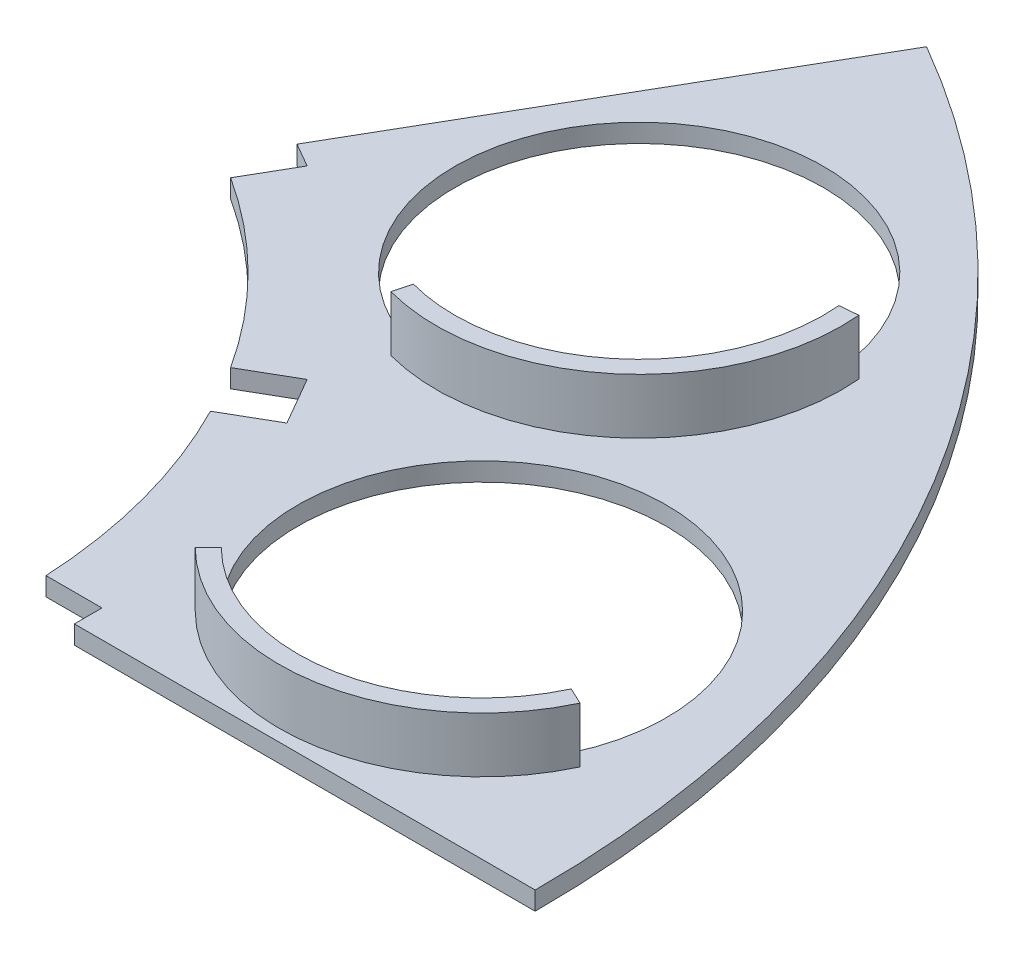
ISO-10303-21;
HEADER;
FILE_DESCRIPTION(('STEP AP214'),'2;1');
FILE_NAME('part.step','',(''),(''),'','','');
FILE_SCHEMA(('AUTOMOTIVE_DESIGN { 1 0 10303 214 1 1 1 1 }'));
ENDSEC;
DATA;
#1=APPLICATION_CONTEXT('core data for automotive mechanical design processes');
#2=APPLICATION_PROTOCOL_DEFINITION('international standard','automotive_design',2000,#1);
#3=PRODUCT_CONTEXT('',#1,'mechanical');
#4=PRODUCT('Part','Part','',(#3));
#5=PRODUCT_RELATED_PRODUCT_CATEGORY('part','',(#4));
#6=PRODUCT_DEFINITION_FORMATION('','',#4);
#7=PRODUCT_DEFINITION_CONTEXT('part definition',#1,'design');
#8=PRODUCT_DEFINITION('design','',#6,#7);
#9=PRODUCT_DEFINITION_SHAPE('','',#8);
#10=(LENGTH_UNIT() NAMED_UNIT(*) SI_UNIT(.MILLI.,.METRE.));
#11=(NAMED_UNIT(*) PLANE_ANGLE_UNIT() SI_UNIT($,.RADIAN.));
#12=(NAMED_UNIT(*) SI_UNIT($,.STERADIAN.) SOLID_ANGLE_UNIT());
#13=UNCERTAINTY_MEASURE_WITH_UNIT(LENGTH_MEASURE(1.E-05),#10,'distance_accuracy_value','');
#14=(GEOMETRIC_REPRESENTATION_CONTEXT(3) GLOBAL_UNCERTAINTY_ASSIGNED_CONTEXT((#13)) GLOBAL_UNIT_ASSIGNED_CONTEXT((#10,
#11,#12)) REPRESENTATION_CONTEXT('',''));
#15=CARTESIAN_POINT('',(0.,0.,0.));
#16=DIRECTION('',(0.,0.,1.));
#17=DIRECTION('',(1.,0.,0.));
#18=AXIS2_PLACEMENT_3D('',#15,#16,#17);
#19=CARTESIAN_POINT('',(0.,5.,0.));
#20=DIRECTION('',(0.,-1.,0.));
#21=DIRECTION('',(0.,0.,-1.));
#22=AXIS2_PLACEMENT_3D('',#19,#20,#21);
#23=CYLINDRICAL_SURFACE('',#22,150.);
#24=CARTESIAN_POINT('',(0.,5.,0.));
#25=DIRECTION('',(0.,-1.,0.));
#26=DIRECTION('',(0.,0.,1.));
#27=AXIS2_PLACEMENT_3D('',#24,#25,#26);
#28=CIRCLE('',#27,150.);
#29=CARTESIAN_POINT('',(81.4013818612761,5.,-125.991329190047));
#30=VERTEX_POINT('',#29);
#31=CARTESIAN_POINT('',(125.991329190046,5.,-81.4013818612767));
#32=VERTEX_POINT('',#31);
#33=EDGE_CURVE('E218',#30,#32,#28,.T.);
#34=ORIENTED_EDGE('',*,*,#33,.F.);
#35=DIRECTION('',(0.,1.,0.));
#36=VECTOR('',#35,1.);
#37=CARTESIAN_POINT('',(81.4013818612761,0.,-125.991329190047));
#38=LINE('',#37,#36);
#39=CARTESIAN_POINT('',(81.4013818612761,0.,-125.991329190047));
#40=VERTEX_POINT('',#39);
#41=EDGE_CURVE('E370',#40,#30,#38,.T.);
#42=ORIENTED_EDGE('',*,*,#41,.F.);
#43=CARTESIAN_POINT('',(0.,0.,0.));
#44=DIRECTION('',(0.,-1.,0.));
#45=DIRECTION('',(0.,0.,1.));
#46=AXIS2_PLACEMENT_3D('',#43,#44,#45);
#47=CIRCLE('',#46,150.);
#48=CARTESIAN_POINT('',(125.991329190046,0.,-81.4013818612767));
#49=VERTEX_POINT('',#48);
#50=EDGE_CURVE('E195',#40,#49,#47,.T.);
#51=ORIENTED_EDGE('',*,*,#50,.T.);
#52=DIRECTION('',(0.,1.,0.));
#53=VECTOR('',#52,1.);
#54=CARTESIAN_POINT('',(125.991329190046,0.,-81.4013818612767));
#55=LINE('',#54,#53);
#56=EDGE_CURVE('E357',#49,#32,#55,.T.);
#57=ORIENTED_EDGE('',*,*,#56,.T.);
#58=EDGE_LOOP('',(#34,#42,#51,#57));
#59=FACE_BOUND('',#58,.T.);
#60=ADVANCED_FACE('F37',(#59),#23,.F.);
#61=CARTESIAN_POINT('',(0.,5.,0.));
#62=DIRECTION('',(0.,1.,0.));
#63=DIRECTION('',(0.,0.,1.));
#64=AXIS2_PLACEMENT_3D('',#61,#62,#63);
#65=PLANE('',#64);
#66=DIRECTION('',(-1.,0.,0.));
#67=VECTOR('',#66,1.);
#68=CARTESIAN_POINT('',(149.812382665786,5.,-7.5));
#69=LINE('',#68,#67);
#70=CARTESIAN_POINT('',(165.,5.,-7.5));
#71=VERTEX_POINT('',#70);
#72=CARTESIAN_POINT('',(149.812382665786,5.,-7.5));
#73=VERTEX_POINT('',#72);
#74=EDGE_CURVE('E182',#71,#73,#69,.T.);
#75=ORIENTED_EDGE('',*,*,#74,.F.);
#76=DIRECTION('',(0.,0.,-1.));
#77=VECTOR('',#76,1.);
#78=CARTESIAN_POINT('',(165.,5.,0.));
#79=LINE('',#78,#77);
#80=CARTESIAN_POINT('',(165.,5.,0.));
#81=VERTEX_POINT('',#80);
#82=EDGE_CURVE('E374',#81,#71,#79,.T.);
#83=ORIENTED_EDGE('',*,*,#82,.F.);
#84=DIRECTION('',(1.,0.,0.));
#85=VECTOR('',#84,1.);
#86=CARTESIAN_POINT('',(150.,5.,0.));
#87=LINE('',#86,#85);
#88=CARTESIAN_POINT('',(290.,5.,0.));
#89=VERTEX_POINT('',#88);
#90=EDGE_CURVE('E189',#81,#89,#87,.T.);
#91=ORIENTED_EDGE('',*,*,#90,.T.);
#92=CARTESIAN_POINT('',(0.,5.,0.));
#93=DIRECTION('',(0.,1.,0.));
#94=DIRECTION('',(0.,0.,1.));
#95=AXIS2_PLACEMENT_3D('',#92,#93,#94);
#96=CIRCLE('',#95,290.);
#97=CARTESIAN_POINT('',(144.999999999999,5.,-251.147367097488));
#98=VERTEX_POINT('',#97);
#99=EDGE_CURVE('E212',#89,#98,#96,.T.);
#100=ORIENTED_EDGE('',*,*,#99,.T.);
#101=DIRECTION('',(-0.499999999999998,0.,0.86602540378444));
#102=VECTOR('',#101,1.);
#103=CARTESIAN_POINT('',(74.9999999999997,5.,-129.903810567666));
#104=LINE('',#103,#102);
#105=CARTESIAN_POINT('',(82.4999999999996,5.,-142.894191624433));
#106=VERTEX_POINT('',#105);
#107=EDGE_CURVE('E207',#98,#106,#104,.T.);
#108=ORIENTED_EDGE('',*,*,#107,.T.);
#109=DIRECTION('',(-0.866025403784439,0.,-0.5));
#110=VECTOR('',#109,1.);
#111=CARTESIAN_POINT('',(82.4999999999996,5.,-142.894191624433));
#112=LINE('',#111,#110);
#113=CARTESIAN_POINT('',(88.9951905283829,5.,-139.144191624433));
#114=VERTEX_POINT('',#113);
#115=EDGE_CURVE('E368',#114,#106,#112,.T.);
#116=ORIENTED_EDGE('',*,*,#115,.F.);
#117=DIRECTION('',(0.499999999999997,0.,-0.86602540378444));
#118=VECTOR('',#117,1.);
#119=CARTESIAN_POINT('',(88.9951905283829,5.,-139.144191624433));
#120=LINE('',#119,#118);
#121=EDGE_CURVE('E371',#30,#114,#120,.T.);
#122=ORIENTED_EDGE('',*,*,#121,.F.);
#123=ORIENTED_EDGE('',*,*,#33,.T.);
#124=DIRECTION('',(-0.866025403784438,0.,0.500000000000002));
#125=VECTOR('',#124,1.);
#126=CARTESIAN_POINT('',(125.991329190046,5.,-81.4013818612767));
#127=LINE('',#126,#125);
#128=CARTESIAN_POINT('',(139.144191624432,5.,-88.9951905283836));
#129=VERTEX_POINT('',#128);
#130=EDGE_CURVE('E341',#129,#32,#127,.T.);
#131=ORIENTED_EDGE('',*,*,#130,.F.);
#132=DIRECTION('',(-0.500000000000001,0.,-0.866025403784438));
#133=VECTOR('',#132,1.);
#134=CARTESIAN_POINT('',(139.144191624432,5.,-88.9951905283836));
#135=LINE('',#134,#133);
#136=CARTESIAN_POINT('',(146.644191624432,5.,-76.004809471617));
#137=VERTEX_POINT('',#136);
#138=EDGE_CURVE('E353',#137,#129,#135,.T.);
#139=ORIENTED_EDGE('',*,*,#138,.F.);
#140=DIRECTION('',(0.866025403784439,0.,-0.5));
#141=VECTOR('',#140,1.);
#142=CARTESIAN_POINT('',(146.644191624432,5.,-76.004809471617));
#143=LINE('',#142,#141);
#144=CARTESIAN_POINT('',(133.491329190046,5.,-68.4110008045102));
#145=VERTEX_POINT('',#144);
#146=EDGE_CURVE('E349',#145,#137,#143,.T.);
#147=ORIENTED_EDGE('',*,*,#146,.F.);
#148=EDGE_CURVE('E205',#145,#73,#28,.T.);
#149=ORIENTED_EDGE('',*,*,#148,.T.);
#150=EDGE_LOOP('',(#75,#83,#91,#100,#108,#116,#122,#123,#131,#139,#147,#149));
#151=FACE_BOUND('',#150,.T.);
#152=DIRECTION('',(-0.996194698091746,0.,0.0871557427476577));
#153=VECTOR('',#152,1.);
#154=CARTESIAN_POINT('',(213.889734162019,5.,-163.892591618095));
#155=LINE('',#154,#153);
#156=CARTESIAN_POINT('',(213.889734162019,5.,-163.892591618095));
#157=VERTEX_POINT('',#156);
#158=CARTESIAN_POINT('',(208.90876067156,5.,-163.456812904356));
#159=VERTEX_POINT('',#158);
#160=EDGE_CURVE('E246',#157,#159,#155,.T.);
#161=ORIENTED_EDGE('',*,*,#160,.F.);
#162=CARTESIAN_POINT('',(159.099025766973,5.,-159.099025766974));
#163=DIRECTION('',(0.,1.,0.));
#164=DIRECTION('',(0.,0.,1.));
#165=AXIS2_PLACEMENT_3D('',#162,#163,#164);
#166=CIRCLE('',#165,55.);
#167=CARTESIAN_POINT('',(144.863978286334,5.,-105.973105321075));
#168=VERTEX_POINT('',#167);
#169=EDGE_CURVE('E250',#168,#157,#166,.T.);
#170=ORIENTED_EDGE('',*,*,#169,.F.);
#171=DIRECTION('',(-0.25881904510252,0.,0.965925826289069));
#172=VECTOR('',#171,1.);
#173=CARTESIAN_POINT('',(146.158073511847,5.,-110.80273445252));
#174=LINE('',#173,#172);
#175=CARTESIAN_POINT('',(146.158073511847,5.,-110.80273445252));
#176=VERTEX_POINT('',#175);
#177=EDGE_CURVE('E253',#176,#168,#174,.T.);
#178=ORIENTED_EDGE('',*,*,#177,.F.);
#179=CARTESIAN_POINT('',(159.099025766973,5.,-159.099025766974));
#180=DIRECTION('',(0.,1.,0.));
#181=DIRECTION('',(0.,0.,1.));
#182=AXIS2_PLACEMENT_3D('',#179,#180,#181);
#183=CIRCLE('',#182,50.);
#184=EDGE_CURVE('E224',#159,#176,#183,.T.);
#185=ORIENTED_EDGE('',*,*,#184,.F.);
#186=EDGE_LOOP('',(#161,#170,#178,#185));
#187=FACE_BOUND('',#186,.T.);
#188=CARTESIAN_POINT('',(217.33331091504,5.,-58.2342851480674));
#189=DIRECTION('',(0.,1.,0.));
#190=DIRECTION('',(0.,0.,1.));
#191=AXIS2_PLACEMENT_3D('',#188,#189,#190);
#192=CIRCLE('',#191,55.);
#193=CARTESIAN_POINT('',(178.44243794978,5.,-19.3434121828074));
#194=VERTEX_POINT('',#193);
#195=CARTESIAN_POINT('',(267.180239202056,5.,-34.9902807523289));
#196=VERTEX_POINT('',#195);
#197=EDGE_CURVE('E276',#194,#196,#192,.T.);
#198=ORIENTED_EDGE('',*,*,#197,.F.);
#199=DIRECTION('',(-0.707106781186549,0.,0.707106781186546));
#200=VECTOR('',#199,1.);
#201=CARTESIAN_POINT('',(181.977971855713,5.,-22.8789460887401));
#202=LINE('',#201,#200);
#203=CARTESIAN_POINT('',(181.977971855713,5.,-22.8789460887401));
#204=VERTEX_POINT('',#203);
#205=EDGE_CURVE('E256',#204,#194,#202,.T.);
#206=ORIENTED_EDGE('',*,*,#205,.F.);
#207=CARTESIAN_POINT('',(217.33331091504,5.,-58.2342851480674));
#208=DIRECTION('',(0.,1.,0.));
#209=DIRECTION('',(0.,0.,1.));
#210=AXIS2_PLACEMENT_3D('',#207,#208,#209);
#211=CIRCLE('',#210,50.);
#212=CARTESIAN_POINT('',(262.648700266873,5.,-37.1033720610323));
#213=VERTEX_POINT('',#212);
#214=EDGE_CURVE('E228',#213,#204,#211,.T.);
#215=ORIENTED_EDGE('',*,*,#214,.F.);
#216=DIRECTION('',(-0.906307787036652,0.,-0.422618261740696));
#217=VECTOR('',#216,1.);
#218=CARTESIAN_POINT('',(262.648700266873,5.,-37.1033720610323));
#219=LINE('',#218,#217);
#220=EDGE_CURVE('E267',#196,#213,#219,.T.);
#221=ORIENTED_EDGE('',*,*,#220,.F.);
#222=EDGE_LOOP('',(#198,#206,#215,#221));
#223=FACE_BOUND('',#222,.T.);
#224=ADVANCED_FACE('F397',(#151,#187,#223),#65,.T.);
#225=CARTESIAN_POINT('',(133.491329190046,0.,-68.4110008045102));
#226=VERTEX_POINT('',#225);
#227=CARTESIAN_POINT('',(149.812382665786,0.,-7.5));
#228=VERTEX_POINT('',#227);
#229=EDGE_CURVE('E200',#226,#228,#47,.T.);
#230=ORIENTED_EDGE('',*,*,#229,.T.);
#231=DIRECTION('',(0.,1.,0.));
#232=VECTOR('',#231,1.);
#233=CARTESIAN_POINT('',(149.812382665786,0.,-7.5));
#234=LINE('',#233,#232);
#235=EDGE_CURVE('E320',#228,#73,#234,.T.);
#236=ORIENTED_EDGE('',*,*,#235,.T.);
#237=ORIENTED_EDGE('',*,*,#148,.F.);
#238=DIRECTION('',(0.,1.,0.));
#239=VECTOR('',#238,1.);
#240=CARTESIAN_POINT('',(133.491329190046,0.,-68.4110008045102));
#241=LINE('',#240,#239);
#242=EDGE_CURVE('E348',#226,#145,#241,.T.);
#243=ORIENTED_EDGE('',*,*,#242,.F.);
#244=EDGE_LOOP('',(#230,#236,#237,#243));
#245=FACE_BOUND('',#244,.T.);
#246=ADVANCED_FACE('F39',(#245),#23,.F.);
#247=CARTESIAN_POINT('',(150.,5.,0.));
#248=DIRECTION('',(0.,0.,-1.));
#249=DIRECTION('',(-1.,0.,0.));
#250=AXIS2_PLACEMENT_3D('',#247,#248,#249);
#251=PLANE('',#250);
#252=ORIENTED_EDGE('',*,*,#90,.F.);
#253=DIRECTION('',(0.,1.,0.));
#254=VECTOR('',#253,1.);
#255=CARTESIAN_POINT('',(165.,0.,0.));
#256=LINE('',#255,#254);
#257=CARTESIAN_POINT('',(165.,0.,0.));
#258=VERTEX_POINT('',#257);
#259=EDGE_CURVE('E177',#258,#81,#256,.T.);
#260=ORIENTED_EDGE('',*,*,#259,.F.);
#261=DIRECTION('',(1.,0.,0.));
#262=VECTOR('',#261,1.);
#263=CARTESIAN_POINT('',(150.,0.,0.));
#264=LINE('',#263,#262);
#265=CARTESIAN_POINT('',(290.,0.,0.));
#266=VERTEX_POINT('',#265);
#267=EDGE_CURVE('E188',#258,#266,#264,.T.);
#268=ORIENTED_EDGE('',*,*,#267,.T.);
#269=DIRECTION('',(0.,-1.,0.));
#270=VECTOR('',#269,1.);
#271=CARTESIAN_POINT('',(290.,5.,0.));
#272=LINE('',#271,#270);
#273=EDGE_CURVE('E11',#89,#266,#272,.T.);
#274=ORIENTED_EDGE('',*,*,#273,.F.);
#275=EDGE_LOOP('',(#252,#260,#268,#274));
#276=FACE_BOUND('',#275,.T.);
#277=ADVANCED_FACE('F186',(#276),#251,.F.);
#278=CARTESIAN_POINT('',(0.,5.,0.));
#279=DIRECTION('',(0.,-1.,0.));
#280=DIRECTION('',(0.,0.,-1.));
#281=AXIS2_PLACEMENT_3D('',#278,#279,#280);
#282=CYLINDRICAL_SURFACE('',#281,290.);
#283=CARTESIAN_POINT('',(0.,0.,0.));
#284=DIRECTION('',(0.,1.,0.));
#285=DIRECTION('',(0.,0.,1.));
#286=AXIS2_PLACEMENT_3D('',#283,#284,#285);
#287=CIRCLE('',#286,290.);
#288=CARTESIAN_POINT('',(144.999999999999,0.,-251.147367097488));
#289=VERTEX_POINT('',#288);
#290=EDGE_CURVE('E194',#266,#289,#287,.T.);
#291=ORIENTED_EDGE('',*,*,#290,.T.);
#292=DIRECTION('',(0.,-1.,0.));
#293=VECTOR('',#292,1.);
#294=CARTESIAN_POINT('',(144.999999999999,5.,-251.147367097488));
#295=LINE('',#294,#293);
#296=EDGE_CURVE('E45',#98,#289,#295,.T.);
#297=ORIENTED_EDGE('',*,*,#296,.F.);
#298=ORIENTED_EDGE('',*,*,#99,.F.);
#299=ORIENTED_EDGE('',*,*,#273,.T.);
#300=EDGE_LOOP('',(#291,#297,#298,#299));
#301=FACE_BOUND('',#300,.T.);
#302=ADVANCED_FACE('F415',(#301),#282,.T.);
#303=CARTESIAN_POINT('',(74.9999999999997,5.,-129.903810567666));
#304=DIRECTION('',(0.86602540378444,0.,0.499999999999998));
#305=DIRECTION('',(0.499999999999998,0.,-0.86602540378444));
#306=AXIS2_PLACEMENT_3D('',#303,#304,#305);
#307=PLANE('',#306);
#308=DIRECTION('',(-0.499999999999998,0.,0.86602540378444));
#309=VECTOR('',#308,1.);
#310=CARTESIAN_POINT('',(74.9999999999997,0.,-129.903810567666));
#311=LINE('',#310,#309);
#312=CARTESIAN_POINT('',(82.4999999999996,0.,-142.894191624433));
#313=VERTEX_POINT('',#312);
#314=EDGE_CURVE('E197',#289,#313,#311,.T.);
#315=ORIENTED_EDGE('',*,*,#314,.T.);
#316=DIRECTION('',(0.,1.,0.));
#317=VECTOR('',#316,1.);
#318=CARTESIAN_POINT('',(82.4999999999996,0.,-142.894191624433));
#319=LINE('',#318,#317);
#320=EDGE_CURVE('E352',#313,#106,#319,.T.);
#321=ORIENTED_EDGE('',*,*,#320,.T.);
#322=ORIENTED_EDGE('',*,*,#107,.F.);
#323=ORIENTED_EDGE('',*,*,#296,.T.);
#324=EDGE_LOOP('',(#315,#321,#322,#323));
#325=FACE_BOUND('',#324,.T.);
#326=ADVANCED_FACE('F413',(#325),#307,.F.);
#327=CARTESIAN_POINT('',(0.,0.,0.));
#328=DIRECTION('',(0.,1.,0.));
#329=DIRECTION('',(0.,0.,1.));
#330=AXIS2_PLACEMENT_3D('',#327,#328,#329);
#331=PLANE('',#330);
#332=CARTESIAN_POINT('',(277.604561184667,0.,-36.5473338216145));
#333=DIRECTION('',(0.,-1.,0.));
#334=DIRECTION('',(0.,0.,-1.));
#335=AXIS2_PLACEMENT_3D('',#332,#333,#334);
#336=CIRCLE('',#335,3.60000000000001);
#337=CARTESIAN_POINT('',(277.604561184667,0.,-40.1473338216145));
#338=VERTEX_POINT('',#337);
#339=EDGE_CURVE('E315',#338,#338,#336,.T.);
#340=ORIENTED_EDGE('',*,*,#339,.F.);
#341=EDGE_LOOP('',(#340));
#342=FACE_BOUND('',#341,.T.);
#343=CARTESIAN_POINT('',(168.545626433548,0.,-22.1894526774088));
#344=DIRECTION('',(0.,-1.,0.));
#345=DIRECTION('',(0.,0.,-1.));
#346=AXIS2_PLACEMENT_3D('',#343,#344,#345);
#347=CIRCLE('',#346,3.59999999999999);
#348=CARTESIAN_POINT('',(168.545626433548,0.,-25.7894526774088));
#349=VERTEX_POINT('',#348);
#350=EDGE_CURVE('E319',#349,#349,#347,.T.);
#351=ORIENTED_EDGE('',*,*,#350,.F.);
#352=EDGE_LOOP('',(#351));
#353=FACE_BOUND('',#352,.T.);
#354=CARTESIAN_POINT('',(157.059520526919,0.,-65.0561835020654));
#355=DIRECTION('',(0.,-1.,0.));
#356=DIRECTION('',(0.,0.,-1.));
#357=AXIS2_PLACEMENT_3D('',#354,#355,#356);
#358=CIRCLE('',#357,3.59999999999998);
#359=CARTESIAN_POINT('',(157.059520526919,0.,-68.6561835020654));
#360=VERTEX_POINT('',#359);
#361=EDGE_CURVE('E326',#360,#360,#358,.T.);
#362=ORIENTED_EDGE('',*,*,#361,.F.);
#363=EDGE_LOOP('',(#362));
#364=FACE_BOUND('',#363,.T.);
#365=CARTESIAN_POINT('',(134.87006784951,0.,-103.489442931483));
#366=DIRECTION('',(0.,-1.,0.));
#367=DIRECTION('',(0.,0.,-1.));
#368=AXIS2_PLACEMENT_3D('',#365,#366,#367);
#369=CIRCLE('',#368,3.59999999999998);
#370=CARTESIAN_POINT('',(134.87006784951,0.,-107.089442931483));
#371=VERTEX_POINT('',#370);
#372=EDGE_CURVE('E294',#371,#371,#369,.T.);
#373=ORIENTED_EDGE('',*,*,#372,.F.);
#374=EDGE_LOOP('',(#373));
#375=FACE_BOUND('',#374,.T.);
#376=CARTESIAN_POINT('',(103.489442931482,0.,-134.87006784951));
#377=DIRECTION('',(0.,-1.,0.));
#378=DIRECTION('',(0.,0.,-1.));
#379=AXIS2_PLACEMENT_3D('',#376,#377,#378);
#380=CIRCLE('',#379,3.6);
#381=CARTESIAN_POINT('',(103.489442931482,0.,-138.47006784951));
#382=VERTEX_POINT('',#381);
#383=EDGE_CURVE('E293',#382,#382,#380,.T.);
#384=ORIENTED_EDGE('',*,*,#383,.F.);
#385=EDGE_LOOP('',(#384));
#386=FACE_BOUND('',#385,.T.);
#387=CARTESIAN_POINT('',(170.453200122441,0.,-222.138935281546));
#388=DIRECTION('',(0.,-1.,0.));
#389=DIRECTION('',(0.,0.,-1.));
#390=AXIS2_PLACEMENT_3D('',#387,#388,#389);
#391=CIRCLE('',#390,3.59999999999998);
#392=CARTESIAN_POINT('',(170.453200122441,0.,-225.738935281546));
#393=VERTEX_POINT('',#392);
#394=EDGE_CURVE('E300',#393,#393,#391,.T.);
#395=ORIENTED_EDGE('',*,*,#394,.F.);
#396=EDGE_LOOP('',(#395));
#397=FACE_BOUND('',#396,.T.);
#398=CARTESIAN_POINT('',(222.138935281546,0.,-170.453200122442));
#399=DIRECTION('',(0.,-1.,0.));
#400=DIRECTION('',(0.,0.,-1.));
#401=AXIS2_PLACEMENT_3D('',#398,#399,#400);
#402=CIRCLE('',#401,3.59999999999998);
#403=CARTESIAN_POINT('',(222.138935281546,0.,-174.053200122442));
#404=VERTEX_POINT('',#403);
#405=EDGE_CURVE('E306',#404,#404,#402,.T.);
#406=ORIENTED_EDGE('',*,*,#405,.F.);
#407=EDGE_LOOP('',(#406));
#408=FACE_BOUND('',#407,.T.);
#409=CARTESIAN_POINT('',(258.68626910316,0.,-107.151361062225));
#410=DIRECTION('',(0.,-1.,0.));
#411=DIRECTION('',(0.,0.,-1.));
#412=AXIS2_PLACEMENT_3D('',#409,#410,#411);
#413=CIRCLE('',#412,3.60000000000001);
#414=CARTESIAN_POINT('',(258.68626910316,0.,-110.751361062225));
#415=VERTEX_POINT('',#414);
#416=EDGE_CURVE('E312',#415,#415,#413,.T.);
#417=ORIENTED_EDGE('',*,*,#416,.F.);
#418=EDGE_LOOP('',(#417));
#419=FACE_BOUND('',#418,.T.);
#420=CARTESIAN_POINT('',(217.33331091504,0.,-58.2342851480674));
#421=DIRECTION('',(0.,1.,0.));
#422=DIRECTION('',(0.,0.,1.));
#423=AXIS2_PLACEMENT_3D('',#420,#421,#422);
#424=CIRCLE('',#423,50.);
#425=CARTESIAN_POINT('',(217.33331091504,0.,-8.23428514806733));
#426=VERTEX_POINT('',#425);
#427=EDGE_CURVE('E231',#426,#426,#424,.T.);
#428=ORIENTED_EDGE('',*,*,#427,.T.);
#429=EDGE_LOOP('',(#428));
#430=FACE_BOUND('',#429,.T.);
#431=CARTESIAN_POINT('',(159.099025766973,0.,-159.099025766974));
#432=DIRECTION('',(0.,1.,0.));
#433=DIRECTION('',(0.,0.,1.));
#434=AXIS2_PLACEMENT_3D('',#431,#432,#433);
#435=CIRCLE('',#434,50.);
#436=CARTESIAN_POINT('',(159.099025766973,0.,-109.099025766974));
#437=VERTEX_POINT('',#436);
#438=EDGE_CURVE('E221',#437,#437,#435,.T.);
#439=ORIENTED_EDGE('',*,*,#438,.T.);
#440=EDGE_LOOP('',(#439));
#441=FACE_BOUND('',#440,.T.);
#442=DIRECTION('',(0.,0.,-1.));
#443=VECTOR('',#442,1.);
#444=CARTESIAN_POINT('',(165.,0.,0.));
#445=LINE('',#444,#443);
#446=CARTESIAN_POINT('',(165.,0.,-7.5));
#447=VERTEX_POINT('',#446);
#448=EDGE_CURVE('E173',#258,#447,#445,.T.);
#449=ORIENTED_EDGE('',*,*,#448,.T.);
#450=DIRECTION('',(-1.,0.,0.));
#451=VECTOR('',#450,1.);
#452=CARTESIAN_POINT('',(149.812382665786,0.,-7.5));
#453=LINE('',#452,#451);
#454=EDGE_CURVE('E52',#447,#228,#453,.T.);
#455=ORIENTED_EDGE('',*,*,#454,.T.);
#456=ORIENTED_EDGE('',*,*,#229,.F.);
#457=DIRECTION('',(0.866025403784439,0.,-0.5));
#458=VECTOR('',#457,1.);
#459=CARTESIAN_POINT('',(146.644191624432,0.,-76.004809471617));
#460=LINE('',#459,#458);
#461=CARTESIAN_POINT('',(146.644191624432,0.,-76.004809471617));
#462=VERTEX_POINT('',#461);
#463=EDGE_CURVE('E338',#226,#462,#460,.T.);
#464=ORIENTED_EDGE('',*,*,#463,.T.);
#465=DIRECTION('',(-0.500000000000001,0.,-0.866025403784438));
#466=VECTOR('',#465,1.);
#467=CARTESIAN_POINT('',(139.144191624432,0.,-88.9951905283836));
#468=LINE('',#467,#466);
#469=CARTESIAN_POINT('',(139.144191624432,0.,-88.9951905283836));
#470=VERTEX_POINT('',#469);
#471=EDGE_CURVE('E342',#462,#470,#468,.T.);
#472=ORIENTED_EDGE('',*,*,#471,.T.);
#473=DIRECTION('',(-0.866025403784438,0.,0.500000000000002));
#474=VECTOR('',#473,1.);
#475=CARTESIAN_POINT('',(125.991329190046,0.,-81.4013818612767));
#476=LINE('',#475,#474);
#477=EDGE_CURVE('E345',#470,#49,#476,.T.);
#478=ORIENTED_EDGE('',*,*,#477,.T.);
#479=ORIENTED_EDGE('',*,*,#50,.F.);
#480=DIRECTION('',(0.499999999999997,0.,-0.86602540378444));
#481=VECTOR('',#480,1.);
#482=CARTESIAN_POINT('',(88.9951905283829,0.,-139.144191624433));
#483=LINE('',#482,#481);
#484=CARTESIAN_POINT('',(88.9951905283829,0.,-139.144191624433));
#485=VERTEX_POINT('',#484);
#486=EDGE_CURVE('E365',#40,#485,#483,.T.);
#487=ORIENTED_EDGE('',*,*,#486,.T.);
#488=DIRECTION('',(-0.866025403784439,0.,-0.5));
#489=VECTOR('',#488,1.);
#490=CARTESIAN_POINT('',(82.4999999999996,0.,-142.894191624433));
#491=LINE('',#490,#489);
#492=EDGE_CURVE('E60',#485,#313,#491,.T.);
#493=ORIENTED_EDGE('',*,*,#492,.T.);
#494=ORIENTED_EDGE('',*,*,#314,.F.);
#495=ORIENTED_EDGE('',*,*,#290,.F.);
#496=ORIENTED_EDGE('',*,*,#267,.F.);
#497=EDGE_LOOP('',(#449,#455,#456,#464,#472,#478,#479,#487,#493,#494,#495,#496));
#498=FACE_BOUND('',#497,.T.);
#499=ADVANCED_FACE('F192',(#342,#353,#364,#375,#386,#397,#408,#419,#430,#441,#498),#331,.F.);
#500=CARTESIAN_POINT('',(159.099025766973,0.,-159.099025766974));
#501=DIRECTION('',(0.,1.,0.));
#502=DIRECTION('',(0.,0.,1.));
#503=AXIS2_PLACEMENT_3D('',#500,#501,#502);
#504=CYLINDRICAL_SURFACE('',#503,50.);
#505=ORIENTED_EDGE('',*,*,#438,.F.);
#506=EDGE_LOOP('',(#505));
#507=FACE_BOUND('',#506,.T.);
#508=ORIENTED_EDGE('',*,*,#184,.T.);
#509=DIRECTION('',(0.,-1.,0.));
#510=VECTOR('',#509,1.);
#511=CARTESIAN_POINT('',(146.158073511847,20.,-110.80273445252));
#512=LINE('',#511,#510);
#513=CARTESIAN_POINT('',(146.158073511847,20.,-110.80273445252));
#514=VERTEX_POINT('',#513);
#515=EDGE_CURVE('E225',#514,#176,#512,.T.);
#516=ORIENTED_EDGE('',*,*,#515,.F.);
#517=CARTESIAN_POINT('',(159.099025766973,20.,-159.099025766974));
#518=DIRECTION('',(0.,-1.,0.));
#519=DIRECTION('',(0.,0.,1.));
#520=AXIS2_PLACEMENT_3D('',#517,#518,#519);
#521=CIRCLE('',#520,50.);
#522=CARTESIAN_POINT('',(208.90876067156,20.,-163.456812904356));
#523=VERTEX_POINT('',#522);
#524=EDGE_CURVE('E249',#523,#514,#521,.T.);
#525=ORIENTED_EDGE('',*,*,#524,.F.);
#526=DIRECTION('',(0.,-1.,0.));
#527=VECTOR('',#526,1.);
#528=CARTESIAN_POINT('',(208.90876067156,20.,-163.456812904356));
#529=LINE('',#528,#527);
#530=EDGE_CURVE('E242',#523,#159,#529,.T.);
#531=ORIENTED_EDGE('',*,*,#530,.T.);
#532=EDGE_LOOP('',(#508,#516,#525,#531));
#533=FACE_BOUND('',#532,.T.);
#534=ADVANCED_FACE('F421',(#507,#533),#504,.F.);
#535=CARTESIAN_POINT('',(217.33331091504,0.,-58.2342851480674));
#536=DIRECTION('',(0.,1.,0.));
#537=DIRECTION('',(0.,0.,1.));
#538=AXIS2_PLACEMENT_3D('',#535,#536,#537);
#539=CYLINDRICAL_SURFACE('',#538,50.);
#540=ORIENTED_EDGE('',*,*,#427,.F.);
#541=EDGE_LOOP('',(#540));
#542=FACE_BOUND('',#541,.T.);
#543=ORIENTED_EDGE('',*,*,#214,.T.);
#544=DIRECTION('',(0.,-1.,0.));
#545=VECTOR('',#544,1.);
#546=CARTESIAN_POINT('',(181.977971855713,20.,-22.8789460887401));
#547=LINE('',#546,#545);
#548=CARTESIAN_POINT('',(181.977971855713,20.,-22.8789460887401));
#549=VERTEX_POINT('',#548);
#550=EDGE_CURVE('E287',#549,#204,#547,.T.);
#551=ORIENTED_EDGE('',*,*,#550,.F.);
#552=CARTESIAN_POINT('',(217.33331091504,20.,-58.2342851480674));
#553=DIRECTION('',(0.,-1.,0.));
#554=DIRECTION('',(0.,0.,1.));
#555=AXIS2_PLACEMENT_3D('',#552,#553,#554);
#556=CIRCLE('',#555,50.);
#557=CARTESIAN_POINT('',(262.648700266873,20.,-37.1033720610323));
#558=VERTEX_POINT('',#557);
#559=EDGE_CURVE('E264',#558,#549,#556,.T.);
#560=ORIENTED_EDGE('',*,*,#559,.F.);
#561=DIRECTION('',(0.,-1.,0.));
#562=VECTOR('',#561,1.);
#563=CARTESIAN_POINT('',(262.648700266873,20.,-37.1033720610323));
#564=LINE('',#563,#562);
#565=EDGE_CURVE('E274',#558,#213,#564,.T.);
#566=ORIENTED_EDGE('',*,*,#565,.T.);
#567=EDGE_LOOP('',(#543,#551,#560,#566));
#568=FACE_BOUND('',#567,.T.);
#569=ADVANCED_FACE('F452',(#542,#568),#539,.F.);
#570=CARTESIAN_POINT('',(146.158073511847,20.,-110.80273445252));
#571=DIRECTION('',(0.965925826289068,0.,0.25881904510252));
#572=DIRECTION('',(0.25881904510252,0.,-0.965925826289069));
#573=AXIS2_PLACEMENT_3D('',#570,#571,#572);
#574=PLANE('',#573);
#575=ORIENTED_EDGE('',*,*,#177,.T.);
#576=DIRECTION('',(0.,-1.,0.));
#577=VECTOR('',#576,1.);
#578=CARTESIAN_POINT('',(144.863978286334,20.,-105.973105321075));
#579=LINE('',#578,#577);
#580=CARTESIAN_POINT('',(144.863978286334,20.,-105.973105321075));
#581=VERTEX_POINT('',#580);
#582=EDGE_CURVE('E236',#581,#168,#579,.T.);
#583=ORIENTED_EDGE('',*,*,#582,.F.);
#584=DIRECTION('',(-0.25881904510252,0.,0.965925826289069));
#585=VECTOR('',#584,1.);
#586=CARTESIAN_POINT('',(146.158073511847,20.,-110.80273445252));
#587=LINE('',#586,#585);
#588=EDGE_CURVE('E260',#514,#581,#587,.T.);
#589=ORIENTED_EDGE('',*,*,#588,.F.);
#590=ORIENTED_EDGE('',*,*,#515,.T.);
#591=EDGE_LOOP('',(#575,#583,#589,#590));
#592=FACE_BOUND('',#591,.T.);
#593=ADVANCED_FACE('F464',(#592),#574,.F.);
#594=CARTESIAN_POINT('',(159.099025766973,20.,-159.099025766974));
#595=DIRECTION('',(0.,-1.,0.));
#596=DIRECTION('',(0.,0.,-1.));
#597=AXIS2_PLACEMENT_3D('',#594,#595,#596);
#598=CYLINDRICAL_SURFACE('',#597,55.);
#599=ORIENTED_EDGE('',*,*,#169,.T.);
#600=DIRECTION('',(0.,-1.,0.));
#601=VECTOR('',#600,1.);
#602=CARTESIAN_POINT('',(213.889734162019,20.,-163.892591618095));
#603=LINE('',#602,#601);
#604=CARTESIAN_POINT('',(213.889734162019,20.,-163.892591618095));
#605=VERTEX_POINT('',#604);
#606=EDGE_CURVE('E239',#605,#157,#603,.T.);
#607=ORIENTED_EDGE('',*,*,#606,.F.);
#608=CARTESIAN_POINT('',(159.099025766973,20.,-159.099025766974));
#609=DIRECTION('',(0.,1.,0.));
#610=DIRECTION('',(0.,0.,1.));
#611=AXIS2_PLACEMENT_3D('',#608,#609,#610);
#612=CIRCLE('',#611,55.);
#613=EDGE_CURVE('E258',#581,#605,#612,.T.);
#614=ORIENTED_EDGE('',*,*,#613,.F.);
#615=ORIENTED_EDGE('',*,*,#582,.T.);
#616=EDGE_LOOP('',(#599,#607,#614,#615));
#617=FACE_BOUND('',#616,.T.);
#618=ADVANCED_FACE('F475',(#617),#598,.T.);
#619=CARTESIAN_POINT('',(213.889734162019,20.,-163.892591618095));
#620=DIRECTION('',(0.0871557427476577,0.,0.996194698091746));
#621=DIRECTION('',(0.996194698091746,0.,-0.0871557427476577));
#622=AXIS2_PLACEMENT_3D('',#619,#620,#621);
#623=PLANE('',#622);
#624=ORIENTED_EDGE('',*,*,#160,.T.);
#625=ORIENTED_EDGE('',*,*,#530,.F.);
#626=DIRECTION('',(-0.996194698091746,0.,0.0871557427476577));
#627=VECTOR('',#626,1.);
#628=CARTESIAN_POINT('',(213.889734162019,20.,-163.892591618095));
#629=LINE('',#628,#627);
#630=EDGE_CURVE('E245',#605,#523,#629,.T.);
#631=ORIENTED_EDGE('',*,*,#630,.F.);
#632=ORIENTED_EDGE('',*,*,#606,.T.);
#633=EDGE_LOOP('',(#624,#625,#631,#632));
#634=FACE_BOUND('',#633,.T.);
#635=ADVANCED_FACE('F486',(#634),#623,.F.);
#636=CARTESIAN_POINT('',(159.099025766973,20.,-159.099025766974));
#637=DIRECTION('',(0.,1.,0.));
#638=DIRECTION('',(0.,0.,1.));
#639=AXIS2_PLACEMENT_3D('',#636,#637,#638);
#640=PLANE('',#639);
#641=ORIENTED_EDGE('',*,*,#524,.T.);
#642=ORIENTED_EDGE('',*,*,#588,.T.);
#643=ORIENTED_EDGE('',*,*,#613,.T.);
#644=ORIENTED_EDGE('',*,*,#630,.T.);
#645=EDGE_LOOP('',(#641,#642,#643,#644));
#646=FACE_BOUND('',#645,.T.);
#647=ADVANCED_FACE('F497',(#646),#640,.T.);
#648=CARTESIAN_POINT('',(181.977971855713,20.,-22.8789460887401));
#649=DIRECTION('',(0.707106781186546,0.,0.707106781186549));
#650=DIRECTION('',(0.707106781186549,0.,-0.707106781186546));
#651=AXIS2_PLACEMENT_3D('',#648,#649,#650);
#652=PLANE('',#651);
#653=ORIENTED_EDGE('',*,*,#205,.T.);
#654=DIRECTION('',(0.,-1.,0.));
#655=VECTOR('',#654,1.);
#656=CARTESIAN_POINT('',(178.44243794978,20.,-19.3434121828074));
#657=LINE('',#656,#655);
#658=CARTESIAN_POINT('',(178.44243794978,20.,-19.3434121828074));
#659=VERTEX_POINT('',#658);
#660=EDGE_CURVE('E284',#659,#194,#657,.T.);
#661=ORIENTED_EDGE('',*,*,#660,.F.);
#662=DIRECTION('',(-0.707106781186549,0.,0.707106781186546));
#663=VECTOR('',#662,1.);
#664=CARTESIAN_POINT('',(181.977971855713,20.,-22.8789460887401));
#665=LINE('',#664,#663);
#666=EDGE_CURVE('E268',#549,#659,#665,.T.);
#667=ORIENTED_EDGE('',*,*,#666,.F.);
#668=ORIENTED_EDGE('',*,*,#550,.T.);
#669=EDGE_LOOP('',(#653,#661,#667,#668));
#670=FACE_BOUND('',#669,.T.);
#671=ADVANCED_FACE('F508',(#670),#652,.F.);
#672=CARTESIAN_POINT('',(217.33331091504,20.,-58.2342851480674));
#673=DIRECTION('',(0.,-1.,0.));
#674=DIRECTION('',(0.,0.,-1.));
#675=AXIS2_PLACEMENT_3D('',#672,#673,#674);
#676=CYLINDRICAL_SURFACE('',#675,55.);
#677=ORIENTED_EDGE('',*,*,#197,.T.);
#678=DIRECTION('',(0.,-1.,0.));
#679=VECTOR('',#678,1.);
#680=CARTESIAN_POINT('',(267.180239202056,20.,-34.9902807523289));
#681=LINE('',#680,#679);
#682=CARTESIAN_POINT('',(267.180239202056,20.,-34.9902807523289));
#683=VERTEX_POINT('',#682);
#684=EDGE_CURVE('E281',#683,#196,#681,.T.);
#685=ORIENTED_EDGE('',*,*,#684,.F.);
#686=CARTESIAN_POINT('',(217.33331091504,20.,-58.2342851480674));
#687=DIRECTION('',(0.,1.,0.));
#688=DIRECTION('',(0.,0.,1.));
#689=AXIS2_PLACEMENT_3D('',#686,#687,#688);
#690=CIRCLE('',#689,55.);
#691=EDGE_CURVE('E270',#659,#683,#690,.T.);
#692=ORIENTED_EDGE('',*,*,#691,.F.);
#693=ORIENTED_EDGE('',*,*,#660,.T.);
#694=EDGE_LOOP('',(#677,#685,#692,#693));
#695=FACE_BOUND('',#694,.T.);
#696=ADVANCED_FACE('F519',(#695),#676,.T.);
#697=CARTESIAN_POINT('',(262.648700266873,20.,-37.1033720610323));
#698=DIRECTION('',(-0.422618261740696,0.,0.906307787036652));
#699=DIRECTION('',(0.906307787036652,0.,0.422618261740696));
#700=AXIS2_PLACEMENT_3D('',#697,#698,#699);
#701=PLANE('',#700);
#702=ORIENTED_EDGE('',*,*,#220,.T.);
#703=ORIENTED_EDGE('',*,*,#565,.F.);
#704=DIRECTION('',(-0.906307787036652,0.,-0.422618261740696));
#705=VECTOR('',#704,1.);
#706=CARTESIAN_POINT('',(262.648700266873,20.,-37.1033720610323));
#707=LINE('',#706,#705);
#708=EDGE_CURVE('E272',#683,#558,#707,.T.);
#709=ORIENTED_EDGE('',*,*,#708,.F.);
#710=ORIENTED_EDGE('',*,*,#684,.T.);
#711=EDGE_LOOP('',(#702,#703,#709,#710));
#712=FACE_BOUND('',#711,.T.);
#713=ADVANCED_FACE('F530',(#712),#701,.F.);
#714=CARTESIAN_POINT('',(217.33331091504,20.,-58.2342851480674));
#715=DIRECTION('',(0.,1.,0.));
#716=DIRECTION('',(0.,0.,1.));
#717=AXIS2_PLACEMENT_3D('',#714,#715,#716);
#718=PLANE('',#717);
#719=ORIENTED_EDGE('',*,*,#559,.T.);
#720=ORIENTED_EDGE('',*,*,#666,.T.);
#721=ORIENTED_EDGE('',*,*,#691,.T.);
#722=ORIENTED_EDGE('',*,*,#708,.T.);
#723=EDGE_LOOP('',(#719,#720,#721,#722));
#724=FACE_BOUND('',#723,.T.);
#725=ADVANCED_FACE('F541',(#724),#718,.T.);
#726=CARTESIAN_POINT('',(258.68626910316,4.4,-107.151361062225));
#727=DIRECTION('',(0.,-1.,0.));
#728=DIRECTION('',(0.,0.,-1.));
#729=AXIS2_PLACEMENT_3D('',#726,#727,#728);
#730=CYLINDRICAL_SURFACE('',#729,3.60000000000001);
#731=CARTESIAN_POINT('',(258.68626910316,4.4,-107.151361062225));
#732=DIRECTION('',(0.,-1.,0.));
#733=DIRECTION('',(0.,0.,-1.));
#734=AXIS2_PLACEMENT_3D('',#731,#732,#733);
#735=CIRCLE('',#734,3.60000000000001);
#736=CARTESIAN_POINT('',(258.68626910316,4.4,-110.751361062225));
#737=VERTEX_POINT('',#736);
#738=EDGE_CURVE('E309',#737,#737,#735,.T.);
#739=ORIENTED_EDGE('',*,*,#738,.F.);
#740=EDGE_LOOP('',(#739));
#741=FACE_BOUND('',#740,.T.);
#742=ORIENTED_EDGE('',*,*,#416,.T.);
#743=EDGE_LOOP('',(#742));
#744=FACE_BOUND('',#743,.T.);
#745=ADVANCED_FACE('F552',(#741,#744),#730,.F.);
#746=CARTESIAN_POINT('',(258.68626910316,4.4,-107.151361062225));
#747=DIRECTION('',(0.,-1.,0.));
#748=DIRECTION('',(0.,0.,-1.));
#749=AXIS2_PLACEMENT_3D('',#746,#747,#748);
#750=PLANE('',#749);
#751=ORIENTED_EDGE('',*,*,#738,.T.);
#752=EDGE_LOOP('',(#751));
#753=FACE_BOUND('',#752,.T.);
#754=ADVANCED_FACE('F563',(#753),#750,.T.);
#755=CARTESIAN_POINT('',(222.138935281546,4.4,-170.453200122442));
#756=DIRECTION('',(0.,-1.,0.));
#757=DIRECTION('',(0.,0.,-1.));
#758=AXIS2_PLACEMENT_3D('',#755,#756,#757);
#759=CYLINDRICAL_SURFACE('',#758,3.59999999999998);
#760=CARTESIAN_POINT('',(222.138935281546,4.4,-170.453200122442));
#761=DIRECTION('',(0.,-1.,0.));
#762=DIRECTION('',(0.,0.,-1.));
#763=AXIS2_PLACEMENT_3D('',#760,#761,#762);
#764=CIRCLE('',#763,3.59999999999998);
#765=CARTESIAN_POINT('',(222.138935281546,4.4,-174.053200122442));
#766=VERTEX_POINT('',#765);
#767=EDGE_CURVE('E303',#766,#766,#764,.T.);
#768=ORIENTED_EDGE('',*,*,#767,.F.);
#769=EDGE_LOOP('',(#768));
#770=FACE_BOUND('',#769,.T.);
#771=ORIENTED_EDGE('',*,*,#405,.T.);
#772=EDGE_LOOP('',(#771));
#773=FACE_BOUND('',#772,.T.);
#774=ADVANCED_FACE('F574',(#770,#773),#759,.F.);
#775=CARTESIAN_POINT('',(222.138935281546,4.4,-170.453200122442));
#776=DIRECTION('',(0.,-1.,0.));
#777=DIRECTION('',(0.,0.,-1.));
#778=AXIS2_PLACEMENT_3D('',#775,#776,#777);
#779=PLANE('',#778);
#780=ORIENTED_EDGE('',*,*,#767,.T.);
#781=EDGE_LOOP('',(#780));
#782=FACE_BOUND('',#781,.T.);
#783=ADVANCED_FACE('F585',(#782),#779,.T.);
#784=CARTESIAN_POINT('',(170.453200122441,4.4,-222.138935281546));
#785=DIRECTION('',(0.,-1.,0.));
#786=DIRECTION('',(0.,0.,-1.));
#787=AXIS2_PLACEMENT_3D('',#784,#785,#786);
#788=CYLINDRICAL_SURFACE('',#787,3.59999999999998);
#789=CARTESIAN_POINT('',(170.453200122441,4.4,-222.138935281546));
#790=DIRECTION('',(0.,-1.,0.));
#791=DIRECTION('',(0.,0.,-1.));
#792=AXIS2_PLACEMENT_3D('',#789,#790,#791);
#793=CIRCLE('',#792,3.59999999999998);
#794=CARTESIAN_POINT('',(170.453200122441,4.4,-225.738935281546));
#795=VERTEX_POINT('',#794);
#796=EDGE_CURVE('E297',#795,#795,#793,.T.);
#797=ORIENTED_EDGE('',*,*,#796,.F.);
#798=EDGE_LOOP('',(#797));
#799=FACE_BOUND('',#798,.T.);
#800=ORIENTED_EDGE('',*,*,#394,.T.);
#801=EDGE_LOOP('',(#800));
#802=FACE_BOUND('',#801,.T.);
#803=ADVANCED_FACE('F596',(#799,#802),#788,.F.);
#804=CARTESIAN_POINT('',(170.453200122441,4.4,-222.138935281546));
#805=DIRECTION('',(0.,-1.,0.));
#806=DIRECTION('',(0.,0.,-1.));
#807=AXIS2_PLACEMENT_3D('',#804,#805,#806);
#808=PLANE('',#807);
#809=ORIENTED_EDGE('',*,*,#796,.T.);
#810=EDGE_LOOP('',(#809));
#811=FACE_BOUND('',#810,.T.);
#812=ADVANCED_FACE('F607',(#811),#808,.T.);
#813=CARTESIAN_POINT('',(103.489442931482,4.4,-134.87006784951));
#814=DIRECTION('',(0.,-1.,0.));
#815=DIRECTION('',(0.,0.,-1.));
#816=AXIS2_PLACEMENT_3D('',#813,#814,#815);
#817=CYLINDRICAL_SURFACE('',#816,3.6);
#818=CARTESIAN_POINT('',(103.489442931482,4.4,-134.87006784951));
#819=DIRECTION('',(0.,-1.,0.));
#820=DIRECTION('',(0.,0.,-1.));
#821=AXIS2_PLACEMENT_3D('',#818,#819,#820);
#822=CIRCLE('',#821,3.6);
#823=CARTESIAN_POINT('',(103.489442931482,4.4,-138.47006784951));
#824=VERTEX_POINT('',#823);
#825=EDGE_CURVE('E290',#824,#824,#822,.T.);
#826=ORIENTED_EDGE('',*,*,#825,.F.);
#827=EDGE_LOOP('',(#826));
#828=FACE_BOUND('',#827,.T.);
#829=ORIENTED_EDGE('',*,*,#383,.T.);
#830=EDGE_LOOP('',(#829));
#831=FACE_BOUND('',#830,.T.);
#832=ADVANCED_FACE('F618',(#828,#831),#817,.F.);
#833=CARTESIAN_POINT('',(103.489442931482,4.4,-134.87006784951));
#834=DIRECTION('',(0.,-1.,0.));
#835=DIRECTION('',(0.,0.,-1.));
#836=AXIS2_PLACEMENT_3D('',#833,#834,#835);
#837=PLANE('',#836);
#838=ORIENTED_EDGE('',*,*,#825,.T.);
#839=EDGE_LOOP('',(#838));
#840=FACE_BOUND('',#839,.T.);
#841=ADVANCED_FACE('F629',(#840),#837,.T.);
#842=CARTESIAN_POINT('',(134.87006784951,4.4,-103.489442931483));
#843=DIRECTION('',(0.,-1.,0.));
#844=DIRECTION('',(0.,0.,-1.));
#845=AXIS2_PLACEMENT_3D('',#842,#843,#844);
#846=CYLINDRICAL_SURFACE('',#845,3.59999999999998);
#847=CARTESIAN_POINT('',(134.87006784951,4.4,-103.489442931483));
#848=DIRECTION('',(0.,-1.,0.));
#849=DIRECTION('',(0.,0.,-1.));
#850=AXIS2_PLACEMENT_3D('',#847,#848,#849);
#851=CIRCLE('',#850,3.59999999999998);
#852=CARTESIAN_POINT('',(134.87006784951,4.4,-107.089442931483));
#853=VERTEX_POINT('',#852);
#854=EDGE_CURVE('E329',#853,#853,#851,.T.);
#855=ORIENTED_EDGE('',*,*,#854,.F.);
#856=EDGE_LOOP('',(#855));
#857=FACE_BOUND('',#856,.T.);
#858=ORIENTED_EDGE('',*,*,#372,.T.);
#859=EDGE_LOOP('',(#858));
#860=FACE_BOUND('',#859,.T.);
#861=ADVANCED_FACE('F640',(#857,#860),#846,.F.);
#862=CARTESIAN_POINT('',(134.87006784951,4.4,-103.489442931483));
#863=DIRECTION('',(0.,-1.,0.));
#864=DIRECTION('',(0.,0.,-1.));
#865=AXIS2_PLACEMENT_3D('',#862,#863,#864);
#866=PLANE('',#865);
#867=ORIENTED_EDGE('',*,*,#854,.T.);
#868=EDGE_LOOP('',(#867));
#869=FACE_BOUND('',#868,.T.);
#870=ADVANCED_FACE('F651',(#869),#866,.T.);
#871=CARTESIAN_POINT('',(157.059520526919,4.4,-65.0561835020654));
#872=DIRECTION('',(0.,-1.,0.));
#873=DIRECTION('',(0.,0.,-1.));
#874=AXIS2_PLACEMENT_3D('',#871,#872,#873);
#875=CYLINDRICAL_SURFACE('',#874,3.59999999999998);
#876=CARTESIAN_POINT('',(157.059520526919,4.4,-65.0561835020654));
#877=DIRECTION('',(0.,-1.,0.));
#878=DIRECTION('',(0.,0.,-1.));
#879=AXIS2_PLACEMENT_3D('',#876,#877,#878);
#880=CIRCLE('',#879,3.59999999999998);
#881=CARTESIAN_POINT('',(157.059520526919,4.4,-68.6561835020654));
#882=VERTEX_POINT('',#881);
#883=EDGE_CURVE('E323',#882,#882,#880,.T.);
#884=ORIENTED_EDGE('',*,*,#883,.F.);
#885=EDGE_LOOP('',(#884));
#886=FACE_BOUND('',#885,.T.);
#887=ORIENTED_EDGE('',*,*,#361,.T.);
#888=EDGE_LOOP('',(#887));
#889=FACE_BOUND('',#888,.T.);
#890=ADVANCED_FACE('F662',(#886,#889),#875,.F.);
#891=CARTESIAN_POINT('',(157.059520526919,4.4,-65.0561835020654));
#892=DIRECTION('',(0.,-1.,0.));
#893=DIRECTION('',(0.,0.,-1.));
#894=AXIS2_PLACEMENT_3D('',#891,#892,#893);
#895=PLANE('',#894);
#896=ORIENTED_EDGE('',*,*,#883,.T.);
#897=EDGE_LOOP('',(#896));
#898=FACE_BOUND('',#897,.T.);
#899=ADVANCED_FACE('F673',(#898),#895,.T.);
#900=CARTESIAN_POINT('',(168.545626433548,4.4,-22.1894526774088));
#901=DIRECTION('',(0.,-1.,0.));
#902=DIRECTION('',(0.,0.,-1.));
#903=AXIS2_PLACEMENT_3D('',#900,#901,#902);
#904=CYLINDRICAL_SURFACE('',#903,3.59999999999999);
#905=CARTESIAN_POINT('',(168.545626433548,4.4,-22.1894526774088));
#906=DIRECTION('',(0.,-1.,0.));
#907=DIRECTION('',(0.,0.,-1.));
#908=AXIS2_PLACEMENT_3D('',#905,#906,#907);
#909=CIRCLE('',#908,3.59999999999999);
#910=CARTESIAN_POINT('',(168.545626433548,4.4,-25.7894526774088));
#911=VERTEX_POINT('',#910);
#912=EDGE_CURVE('E316',#911,#911,#909,.T.);
#913=ORIENTED_EDGE('',*,*,#912,.F.);
#914=EDGE_LOOP('',(#913));
#915=FACE_BOUND('',#914,.T.);
#916=ORIENTED_EDGE('',*,*,#350,.T.);
#917=EDGE_LOOP('',(#916));
#918=FACE_BOUND('',#917,.T.);
#919=ADVANCED_FACE('F684',(#915,#918),#904,.F.);
#920=CARTESIAN_POINT('',(168.545626433548,4.4,-22.1894526774088));
#921=DIRECTION('',(0.,-1.,0.));
#922=DIRECTION('',(0.,0.,-1.));
#923=AXIS2_PLACEMENT_3D('',#920,#921,#922);
#924=PLANE('',#923);
#925=ORIENTED_EDGE('',*,*,#912,.T.);
#926=EDGE_LOOP('',(#925));
#927=FACE_BOUND('',#926,.T.);
#928=ADVANCED_FACE('F695',(#927),#924,.T.);
#929=CARTESIAN_POINT('',(277.604561184667,4.4,-36.5473338216145));
#930=DIRECTION('',(0.,-1.,0.));
#931=DIRECTION('',(0.,0.,-1.));
#932=AXIS2_PLACEMENT_3D('',#929,#930,#931);
#933=CYLINDRICAL_SURFACE('',#932,3.60000000000001);
#934=CARTESIAN_POINT('',(277.604561184667,4.4,-36.5473338216145));
#935=DIRECTION('',(0.,-1.,0.));
#936=DIRECTION('',(0.,0.,-1.));
#937=AXIS2_PLACEMENT_3D('',#934,#935,#936);
#938=CIRCLE('',#937,3.60000000000001);
#939=CARTESIAN_POINT('',(277.604561184667,4.4,-40.1473338216145));
#940=VERTEX_POINT('',#939);
#941=EDGE_CURVE('E289',#940,#940,#938,.T.);
#942=ORIENTED_EDGE('',*,*,#941,.F.);
#943=EDGE_LOOP('',(#942));
#944=FACE_BOUND('',#943,.T.);
#945=ORIENTED_EDGE('',*,*,#339,.T.);
#946=EDGE_LOOP('',(#945));
#947=FACE_BOUND('',#946,.T.);
#948=ADVANCED_FACE('F706',(#944,#947),#933,.F.);
#949=CARTESIAN_POINT('',(277.604561184667,4.4,-36.5473338216145));
#950=DIRECTION('',(0.,-1.,0.));
#951=DIRECTION('',(0.,0.,-1.));
#952=AXIS2_PLACEMENT_3D('',#949,#950,#951);
#953=PLANE('',#952);
#954=ORIENTED_EDGE('',*,*,#941,.T.);
#955=EDGE_LOOP('',(#954));
#956=FACE_BOUND('',#955,.T.);
#957=ADVANCED_FACE('F717',(#956),#953,.T.);
#958=CARTESIAN_POINT('',(125.991329190046,0.,-81.4013818612767));
#959=DIRECTION('',(-0.500000000000002,0.,-0.866025403784438));
#960=DIRECTION('',(-0.866025403784438,0.,0.500000000000002));
#961=AXIS2_PLACEMENT_3D('',#958,#959,#960);
#962=PLANE('',#961);
#963=ORIENTED_EDGE('',*,*,#130,.T.);
#964=ORIENTED_EDGE('',*,*,#56,.F.);
#965=ORIENTED_EDGE('',*,*,#477,.F.);
#966=DIRECTION('',(0.,1.,0.));
#967=VECTOR('',#966,1.);
#968=CARTESIAN_POINT('',(139.144191624432,0.,-88.9951905283836));
#969=LINE('',#968,#967);
#970=EDGE_CURVE('E360',#470,#129,#969,.T.);
#971=ORIENTED_EDGE('',*,*,#970,.T.);
#972=EDGE_LOOP('',(#963,#964,#965,#971));
#973=FACE_BOUND('',#972,.T.);
#974=ADVANCED_FACE('F727',(#973),#962,.F.);
#975=CARTESIAN_POINT('',(139.144191624432,0.,-88.9951905283836));
#976=DIRECTION('',(0.866025403784438,0.,-0.500000000000001));
#977=DIRECTION('',(-0.500000000000001,0.,-0.866025403784438));
#978=AXIS2_PLACEMENT_3D('',#975,#976,#977);
#979=PLANE('',#978);
#980=ORIENTED_EDGE('',*,*,#138,.T.);
#981=ORIENTED_EDGE('',*,*,#970,.F.);
#982=ORIENTED_EDGE('',*,*,#471,.F.);
#983=DIRECTION('',(0.,1.,0.));
#984=VECTOR('',#983,1.);
#985=CARTESIAN_POINT('',(146.644191624432,0.,-76.004809471617));
#986=LINE('',#985,#984);
#987=EDGE_CURVE('E362',#462,#137,#986,.T.);
#988=ORIENTED_EDGE('',*,*,#987,.T.);
#989=EDGE_LOOP('',(#980,#981,#982,#988));
#990=FACE_BOUND('',#989,.T.);
#991=ADVANCED_FACE('F402',(#990),#979,.F.);
#992=CARTESIAN_POINT('',(146.644191624432,0.,-76.004809471617));
#993=DIRECTION('',(0.5,0.,0.866025403784439));
#994=DIRECTION('',(0.866025403784439,0.,-0.5));
#995=AXIS2_PLACEMENT_3D('',#992,#993,#994);
#996=PLANE('',#995);
#997=ORIENTED_EDGE('',*,*,#146,.T.);
#998=ORIENTED_EDGE('',*,*,#987,.F.);
#999=ORIENTED_EDGE('',*,*,#463,.F.);
#1000=ORIENTED_EDGE('',*,*,#242,.T.);
#1001=EDGE_LOOP('',(#997,#998,#999,#1000));
#1002=FACE_BOUND('',#1001,.T.);
#1003=ADVANCED_FACE('F393',(#1002),#996,.F.);
#1004=CARTESIAN_POINT('',(82.4999999999996,0.,-142.894191624433));
#1005=DIRECTION('',(0.5,0.,-0.866025403784439));
#1006=DIRECTION('',(-0.866025403784439,0.,-0.5));
#1007=AXIS2_PLACEMENT_3D('',#1004,#1005,#1006);
#1008=PLANE('',#1007);
#1009=ORIENTED_EDGE('',*,*,#115,.T.);
#1010=ORIENTED_EDGE('',*,*,#320,.F.);
#1011=ORIENTED_EDGE('',*,*,#492,.F.);
#1012=DIRECTION('',(0.,1.,0.));
#1013=VECTOR('',#1012,1.);
#1014=CARTESIAN_POINT('',(88.9951905283829,0.,-139.144191624433));
#1015=LINE('',#1014,#1013);
#1016=EDGE_CURVE('E378',#485,#114,#1015,.T.);
#1017=ORIENTED_EDGE('',*,*,#1016,.T.);
#1018=EDGE_LOOP('',(#1009,#1010,#1011,#1017));
#1019=FACE_BOUND('',#1018,.T.);
#1020=ADVANCED_FACE('F412',(#1019),#1008,.F.);
#1021=CARTESIAN_POINT('',(88.9951905283829,0.,-139.144191624433));
#1022=DIRECTION('',(0.86602540378444,0.,0.499999999999997));
#1023=DIRECTION('',(0.499999999999997,0.,-0.86602540378444));
#1024=AXIS2_PLACEMENT_3D('',#1021,#1022,#1023);
#1025=PLANE('',#1024);
#1026=ORIENTED_EDGE('',*,*,#121,.T.);
#1027=ORIENTED_EDGE('',*,*,#1016,.F.);
#1028=ORIENTED_EDGE('',*,*,#486,.F.);
#1029=ORIENTED_EDGE('',*,*,#41,.T.);
#1030=EDGE_LOOP('',(#1026,#1027,#1028,#1029));
#1031=FACE_BOUND('',#1030,.T.);
#1032=ADVANCED_FACE('F411',(#1031),#1025,.F.);
#1033=CARTESIAN_POINT('',(149.812382665786,0.,-7.5));
#1034=DIRECTION('',(0.,0.,-1.));
#1035=DIRECTION('',(-1.,0.,0.));
#1036=AXIS2_PLACEMENT_3D('',#1033,#1034,#1035);
#1037=PLANE('',#1036);
#1038=ORIENTED_EDGE('',*,*,#74,.T.);
#1039=ORIENTED_EDGE('',*,*,#235,.F.);
#1040=ORIENTED_EDGE('',*,*,#454,.F.);
#1041=DIRECTION('',(0.,1.,0.));
#1042=VECTOR('',#1041,1.);
#1043=CARTESIAN_POINT('',(165.,0.,-7.5));
#1044=LINE('',#1043,#1042);
#1045=EDGE_CURVE('E179',#447,#71,#1044,.T.);
#1046=ORIENTED_EDGE('',*,*,#1045,.T.);
#1047=EDGE_LOOP('',(#1038,#1039,#1040,#1046));
#1048=FACE_BOUND('',#1047,.T.);
#1049=ADVANCED_FACE('F818',(#1048),#1037,.F.);
#1050=CARTESIAN_POINT('',(165.,0.,0.));
#1051=DIRECTION('',(1.,0.,0.));
#1052=DIRECTION('',(0.,0.,-1.));
#1053=AXIS2_PLACEMENT_3D('',#1050,#1051,#1052);
#1054=PLANE('',#1053);
#1055=ORIENTED_EDGE('',*,*,#82,.T.);
#1056=ORIENTED_EDGE('',*,*,#1045,.F.);
#1057=ORIENTED_EDGE('',*,*,#448,.F.);
#1058=ORIENTED_EDGE('',*,*,#259,.T.);
#1059=EDGE_LOOP('',(#1055,#1056,#1057,#1058));
#1060=FACE_BOUND('',#1059,.T.);
#1061=ADVANCED_FACE('F176',(#1060),#1054,.F.);
#1062=CLOSED_SHELL('',(#60,#224,#246,#277,#302,#326,#499,#534,#569,#593,#618,#635,#647,#671,
#696,#713,#725,#745,#754,#774,#783,#803,#812,#832,#841,#861,#870,#890,#899,#919,#928,#948,#957,
#974,#991,#1003,#1020,#1032,#1049,#1061));
#1063=MANIFOLD_SOLID_BREP('B2',#1062);
#1064=ADVANCED_BREP_SHAPE_REPRESENTATION('',(#18,#1063),#14);
#1065=SHAPE_DEFINITION_REPRESENTATION(#9,#1064);
ENDSEC;
END-ISO-10303-21;
